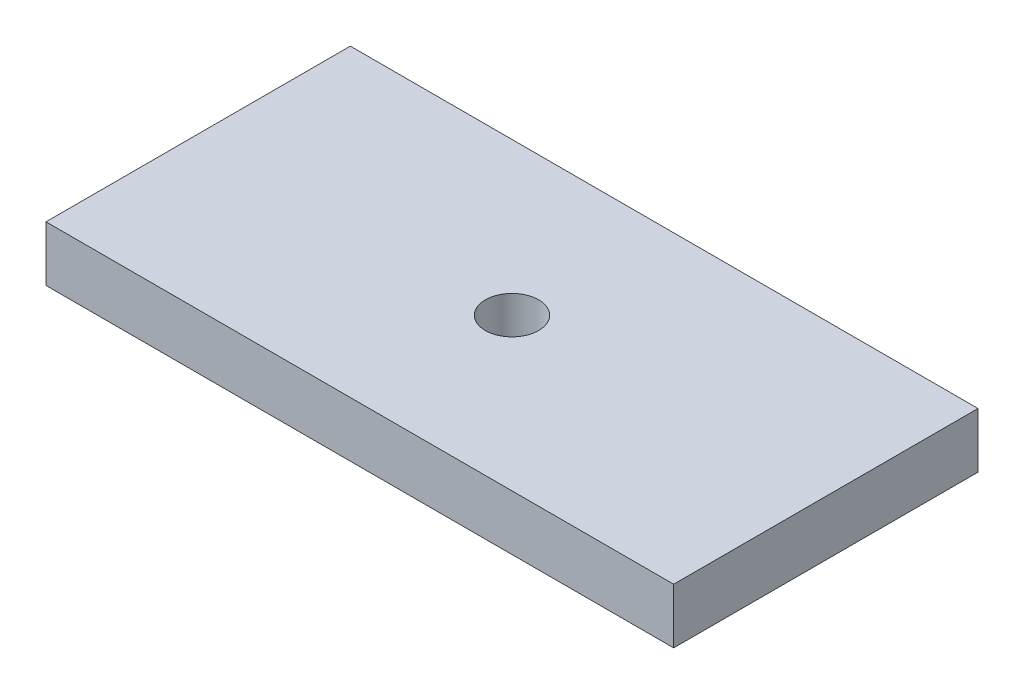
ISO-10303-21;
HEADER;
FILE_DESCRIPTION(('STEP AP214'),'2;1');
FILE_NAME('part.step','',(''),(''),'','','');
FILE_SCHEMA(('AUTOMOTIVE_DESIGN { 1 0 10303 214 1 1 1 1 }'));
ENDSEC;
DATA;
#1=APPLICATION_CONTEXT('core data for automotive mechanical design processes');
#2=APPLICATION_PROTOCOL_DEFINITION('international standard','automotive_design',2000,#1);
#3=PRODUCT_CONTEXT('',#1,'mechanical');
#4=PRODUCT('Part','Part','',(#3));
#5=PRODUCT_RELATED_PRODUCT_CATEGORY('part','',(#4));
#6=PRODUCT_DEFINITION_FORMATION('','',#4);
#7=PRODUCT_DEFINITION_CONTEXT('part definition',#1,'design');
#8=PRODUCT_DEFINITION('design','',#6,#7);
#9=PRODUCT_DEFINITION_SHAPE('','',#8);
#10=(LENGTH_UNIT() NAMED_UNIT(*) SI_UNIT(.MILLI.,.METRE.));
#11=(NAMED_UNIT(*) PLANE_ANGLE_UNIT() SI_UNIT($,.RADIAN.));
#12=(NAMED_UNIT(*) SI_UNIT($,.STERADIAN.) SOLID_ANGLE_UNIT());
#13=UNCERTAINTY_MEASURE_WITH_UNIT(LENGTH_MEASURE(1.E-05),#10,'distance_accuracy_value','');
#14=(GEOMETRIC_REPRESENTATION_CONTEXT(3) GLOBAL_UNCERTAINTY_ASSIGNED_CONTEXT((#13)) GLOBAL_UNIT_ASSIGNED_CONTEXT((#10,
#11,#12)) REPRESENTATION_CONTEXT('',''));
#15=CARTESIAN_POINT('',(0.,0.,0.));
#16=DIRECTION('',(0.,0.,1.));
#17=DIRECTION('',(1.,0.,0.));
#18=AXIS2_PLACEMENT_3D('',#15,#16,#17);
#19=CARTESIAN_POINT('',(0.,1.45,0.));
#20=DIRECTION('',(0.,-1.,0.));
#21=DIRECTION('',(0.,0.,-1.));
#22=AXIS2_PLACEMENT_3D('',#19,#20,#21);
#23=PLANE('',#22);
#24=DIRECTION('',(0.,0.,-1.));
#25=VECTOR('',#24,1.);
#26=CARTESIAN_POINT('',(8.25000000000001,1.45,4.));
#27=LINE('',#26,#25);
#28=CARTESIAN_POINT('',(8.25000000000001,1.45,4.));
#29=VERTEX_POINT('',#28);
#30=CARTESIAN_POINT('',(8.25000000000001,1.45,-4.));
#31=VERTEX_POINT('',#30);
#32=EDGE_CURVE('E91',#29,#31,#27,.T.);
#33=ORIENTED_EDGE('',*,*,#32,.T.);
#34=DIRECTION('',(-1.,0.,0.));
#35=VECTOR('',#34,1.);
#36=CARTESIAN_POINT('',(-8.24999999999999,1.45,-4.));
#37=LINE('',#36,#35);
#38=CARTESIAN_POINT('',(-8.24999999999999,1.45,-4.));
#39=VERTEX_POINT('',#38);
#40=EDGE_CURVE('E86',#31,#39,#37,.T.);
#41=ORIENTED_EDGE('',*,*,#40,.T.);
#42=DIRECTION('',(0.,0.,1.));
#43=VECTOR('',#42,1.);
#44=CARTESIAN_POINT('',(-8.24999999999999,1.45,4.));
#45=LINE('',#44,#43);
#46=CARTESIAN_POINT('',(-8.24999999999999,1.45,4.));
#47=VERTEX_POINT('',#46);
#48=EDGE_CURVE('E87',#39,#47,#45,.T.);
#49=ORIENTED_EDGE('',*,*,#48,.T.);
#50=DIRECTION('',(1.,0.,0.));
#51=VECTOR('',#50,1.);
#52=CARTESIAN_POINT('',(-8.24999999999999,1.45,4.));
#53=LINE('',#52,#51);
#54=EDGE_CURVE('E57',#47,#29,#53,.T.);
#55=ORIENTED_EDGE('',*,*,#54,.T.);
#56=EDGE_LOOP('',(#33,#41,#49,#55));
#57=FACE_BOUND('',#56,.T.);
#58=CARTESIAN_POINT('',(0.,1.45,0.));
#59=DIRECTION('',(0.,1.,0.));
#60=DIRECTION('',(0.,0.,1.));
#61=AXIS2_PLACEMENT_3D('',#58,#59,#60);
#62=CIRCLE('',#61,0.700726940265673);
#63=CARTESIAN_POINT('',(0.,1.45,0.70072694026567));
#64=VERTEX_POINT('',#63);
#65=EDGE_CURVE('E106',#64,#64,#62,.T.);
#66=ORIENTED_EDGE('',*,*,#65,.F.);
#67=EDGE_LOOP('',(#66));
#68=FACE_BOUND('',#67,.T.);
#69=ADVANCED_FACE('F39',(#57,#68),#23,.F.);
#70=CARTESIAN_POINT('',(0.,0.,0.));
#71=DIRECTION('',(0.,-1.,0.));
#72=DIRECTION('',(0.,0.,-1.));
#73=AXIS2_PLACEMENT_3D('',#70,#71,#72);
#74=PLANE('',#73);
#75=DIRECTION('',(0.,0.,-1.));
#76=VECTOR('',#75,1.);
#77=CARTESIAN_POINT('',(8.25000000000001,0.,4.));
#78=LINE('',#77,#76);
#79=CARTESIAN_POINT('',(8.25000000000001,0.,4.));
#80=VERTEX_POINT('',#79);
#81=CARTESIAN_POINT('',(8.25000000000001,0.,-4.));
#82=VERTEX_POINT('',#81);
#83=EDGE_CURVE('E104',#80,#82,#78,.T.);
#84=ORIENTED_EDGE('',*,*,#83,.F.);
#85=DIRECTION('',(1.,0.,0.));
#86=VECTOR('',#85,1.);
#87=CARTESIAN_POINT('',(-8.24999999999999,0.,4.));
#88=LINE('',#87,#86);
#89=CARTESIAN_POINT('',(-8.24999999999999,0.,4.));
#90=VERTEX_POINT('',#89);
#91=EDGE_CURVE('E80',#90,#80,#88,.T.);
#92=ORIENTED_EDGE('',*,*,#91,.F.);
#93=DIRECTION('',(0.,0.,1.));
#94=VECTOR('',#93,1.);
#95=CARTESIAN_POINT('',(-8.24999999999999,0.,4.));
#96=LINE('',#95,#94);
#97=CARTESIAN_POINT('',(-8.24999999999999,0.,-4.));
#98=VERTEX_POINT('',#97);
#99=EDGE_CURVE('E74',#98,#90,#96,.T.);
#100=ORIENTED_EDGE('',*,*,#99,.F.);
#101=DIRECTION('',(-1.,0.,0.));
#102=VECTOR('',#101,1.);
#103=CARTESIAN_POINT('',(-8.24999999999999,0.,-4.));
#104=LINE('',#103,#102);
#105=EDGE_CURVE('E94',#82,#98,#104,.T.);
#106=ORIENTED_EDGE('',*,*,#105,.F.);
#107=EDGE_LOOP('',(#84,#92,#100,#106));
#108=FACE_BOUND('',#107,.T.);
#109=CARTESIAN_POINT('',(0.,0.,0.));
#110=DIRECTION('',(0.,1.,0.));
#111=DIRECTION('',(0.,0.,1.));
#112=AXIS2_PLACEMENT_3D('',#109,#110,#111);
#113=CIRCLE('',#112,0.700726940265673);
#114=CARTESIAN_POINT('',(0.,0.,0.70072694026567));
#115=VERTEX_POINT('',#114);
#116=EDGE_CURVE('E119',#115,#115,#113,.T.);
#117=ORIENTED_EDGE('',*,*,#116,.T.);
#118=EDGE_LOOP('',(#117));
#119=FACE_BOUND('',#118,.T.);
#120=ADVANCED_FACE('F114',(#108,#119),#74,.T.);
#121=CARTESIAN_POINT('',(8.25000000000001,1.45,4.));
#122=DIRECTION('',(-1.,0.,0.));
#123=DIRECTION('',(0.,0.,1.));
#124=AXIS2_PLACEMENT_3D('',#121,#122,#123);
#125=PLANE('',#124);
#126=ORIENTED_EDGE('',*,*,#83,.T.);
#127=DIRECTION('',(0.,-1.,0.));
#128=VECTOR('',#127,1.);
#129=CARTESIAN_POINT('',(8.25000000000001,1.45,-4.));
#130=LINE('',#129,#128);
#131=EDGE_CURVE('E11',#31,#82,#130,.T.);
#132=ORIENTED_EDGE('',*,*,#131,.F.);
#133=ORIENTED_EDGE('',*,*,#32,.F.);
#134=DIRECTION('',(0.,-1.,0.));
#135=VECTOR('',#134,1.);
#136=CARTESIAN_POINT('',(8.25000000000001,1.45,4.));
#137=LINE('',#136,#135);
#138=EDGE_CURVE('E98',#29,#80,#137,.T.);
#139=ORIENTED_EDGE('',*,*,#138,.T.);
#140=EDGE_LOOP('',(#126,#132,#133,#139));
#141=FACE_BOUND('',#140,.T.);
#142=ADVANCED_FACE('F41',(#141),#125,.F.);
#143=CARTESIAN_POINT('',(-8.24999999999999,1.45,-4.));
#144=DIRECTION('',(0.,0.,1.));
#145=DIRECTION('',(1.,0.,0.));
#146=AXIS2_PLACEMENT_3D('',#143,#144,#145);
#147=PLANE('',#146);
#148=ORIENTED_EDGE('',*,*,#105,.T.);
#149=DIRECTION('',(0.,-1.,0.));
#150=VECTOR('',#149,1.);
#151=CARTESIAN_POINT('',(-8.24999999999999,1.45,-4.));
#152=LINE('',#151,#150);
#153=EDGE_CURVE('E48',#39,#98,#152,.T.);
#154=ORIENTED_EDGE('',*,*,#153,.F.);
#155=ORIENTED_EDGE('',*,*,#40,.F.);
#156=ORIENTED_EDGE('',*,*,#131,.T.);
#157=EDGE_LOOP('',(#148,#154,#155,#156));
#158=FACE_BOUND('',#157,.T.);
#159=ADVANCED_FACE('F92',(#158),#147,.F.);
#160=CARTESIAN_POINT('',(-8.24999999999999,1.45,4.));
#161=DIRECTION('',(1.,0.,0.));
#162=DIRECTION('',(0.,0.,-1.));
#163=AXIS2_PLACEMENT_3D('',#160,#161,#162);
#164=PLANE('',#163);
#165=ORIENTED_EDGE('',*,*,#99,.T.);
#166=DIRECTION('',(0.,-1.,0.));
#167=VECTOR('',#166,1.);
#168=CARTESIAN_POINT('',(-8.24999999999999,1.45,4.));
#169=LINE('',#168,#167);
#170=EDGE_CURVE('E96',#47,#90,#169,.T.);
#171=ORIENTED_EDGE('',*,*,#170,.F.);
#172=ORIENTED_EDGE('',*,*,#48,.F.);
#173=ORIENTED_EDGE('',*,*,#153,.T.);
#174=EDGE_LOOP('',(#165,#171,#172,#173));
#175=FACE_BOUND('',#174,.T.);
#176=ADVANCED_FACE('F100',(#175),#164,.F.);
#177=CARTESIAN_POINT('',(-8.24999999999999,1.45,4.));
#178=DIRECTION('',(0.,0.,-1.));
#179=DIRECTION('',(-1.,0.,0.));
#180=AXIS2_PLACEMENT_3D('',#177,#178,#179);
#181=PLANE('',#180);
#182=ORIENTED_EDGE('',*,*,#91,.T.);
#183=ORIENTED_EDGE('',*,*,#138,.F.);
#184=ORIENTED_EDGE('',*,*,#54,.F.);
#185=ORIENTED_EDGE('',*,*,#170,.T.);
#186=EDGE_LOOP('',(#182,#183,#184,#185));
#187=FACE_BOUND('',#186,.T.);
#188=ADVANCED_FACE('F112',(#187),#181,.F.);
#189=CARTESIAN_POINT('',(0.,1.45,0.));
#190=DIRECTION('',(0.,-1.,0.));
#191=DIRECTION('',(0.,0.,-1.));
#192=AXIS2_PLACEMENT_3D('',#189,#190,#191);
#193=CYLINDRICAL_SURFACE('',#192,0.700726940265673);
#194=ORIENTED_EDGE('',*,*,#65,.T.);
#195=EDGE_LOOP('',(#194));
#196=FACE_BOUND('',#195,.T.);
#197=ORIENTED_EDGE('',*,*,#116,.F.);
#198=EDGE_LOOP('',(#197));
#199=FACE_BOUND('',#198,.T.);
#200=ADVANCED_FACE('F125',(#196,#199),#193,.F.);
#201=CLOSED_SHELL('',(#69,#120,#142,#159,#176,#188,#200));
#202=MANIFOLD_SOLID_BREP('B2',#201);
#203=ADVANCED_BREP_SHAPE_REPRESENTATION('',(#18,#202),#14);
#204=SHAPE_DEFINITION_REPRESENTATION(#9,#203);
ENDSEC;
END-ISO-10303-21;
